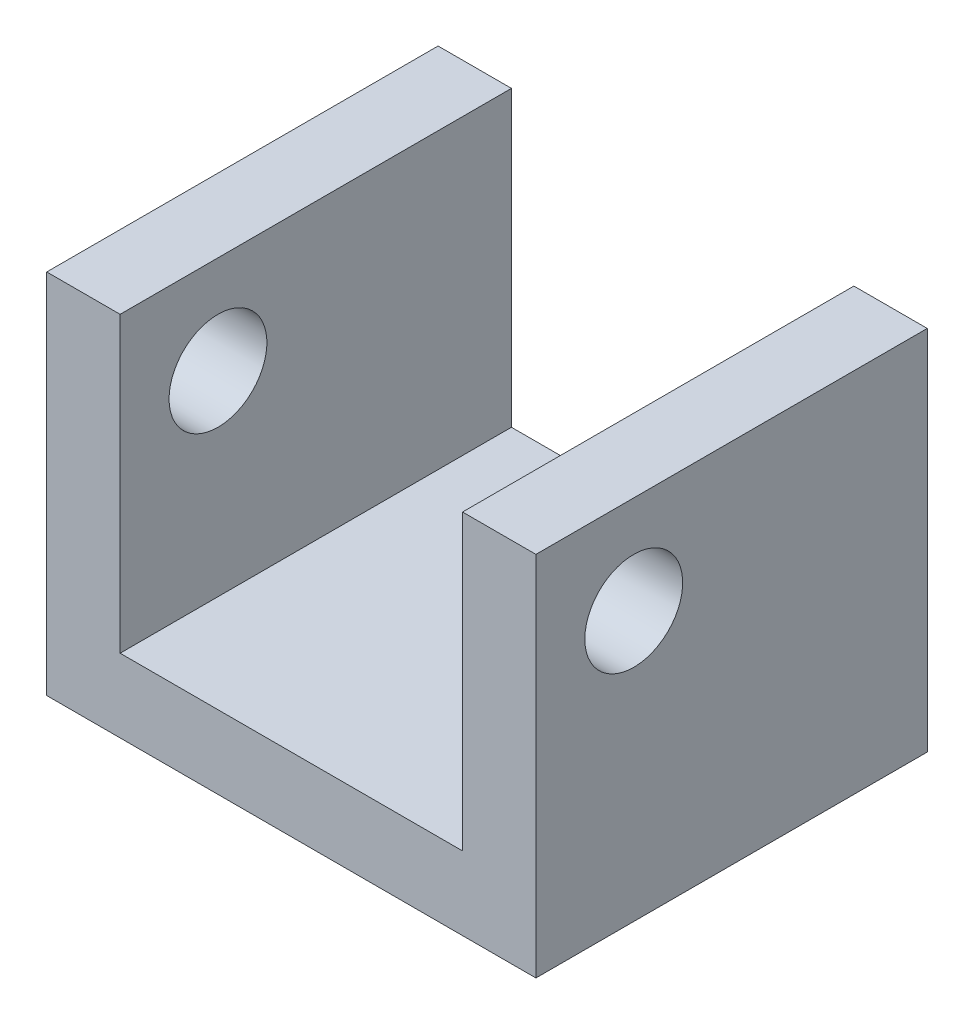
ISO-10303-21;
HEADER;
FILE_DESCRIPTION(('STEP AP214'),'2;1');
FILE_NAME('part.step','',(''),(''),'','','');
FILE_SCHEMA(('AUTOMOTIVE_DESIGN { 1 0 10303 214 1 1 1 1 }'));
ENDSEC;
DATA;
#1=APPLICATION_CONTEXT('core data for automotive mechanical design processes');
#2=APPLICATION_PROTOCOL_DEFINITION('international standard','automotive_design',2000,#1);
#3=PRODUCT_CONTEXT('',#1,'mechanical');
#4=PRODUCT('Part','Part','',(#3));
#5=PRODUCT_RELATED_PRODUCT_CATEGORY('part','',(#4));
#6=PRODUCT_DEFINITION_FORMATION('','',#4);
#7=PRODUCT_DEFINITION_CONTEXT('part definition',#1,'design');
#8=PRODUCT_DEFINITION('design','',#6,#7);
#9=PRODUCT_DEFINITION_SHAPE('','',#8);
#10=(LENGTH_UNIT() NAMED_UNIT(*) SI_UNIT(.MILLI.,.METRE.));
#11=(NAMED_UNIT(*) PLANE_ANGLE_UNIT() SI_UNIT($,.RADIAN.));
#12=(NAMED_UNIT(*) SI_UNIT($,.STERADIAN.) SOLID_ANGLE_UNIT());
#13=UNCERTAINTY_MEASURE_WITH_UNIT(LENGTH_MEASURE(1.E-05),#10,'distance_accuracy_value','');
#14=(GEOMETRIC_REPRESENTATION_CONTEXT(3) GLOBAL_UNCERTAINTY_ASSIGNED_CONTEXT((#13)) GLOBAL_UNIT_ASSIGNED_CONTEXT((#10,
#11,#12)) REPRESENTATION_CONTEXT('',''));
#15=CARTESIAN_POINT('',(0.,0.,0.));
#16=DIRECTION('',(0.,0.,1.));
#17=DIRECTION('',(1.,0.,0.));
#18=AXIS2_PLACEMENT_3D('',#15,#16,#17);
#19=CARTESIAN_POINT('',(0.,1.5,0.));
#20=DIRECTION('',(0.,-1.,0.));
#21=DIRECTION('',(0.,0.,-1.));
#22=AXIS2_PLACEMENT_3D('',#19,#20,#21);
#23=PLANE('',#22);
#24=CARTESIAN_POINT('',(2.18575157973078E-13,1.5,-1.73471109239894));
#25=DIRECTION('',(0.,1.,0.));
#26=DIRECTION('',(0.,0.,1.));
#27=AXIS2_PLACEMENT_3D('',#24,#25,#26);
#28=CIRCLE('',#27,1.2);
#29=CARTESIAN_POINT('',(2.18575157973078E-13,1.5,-0.534711092398936));
#30=VERTEX_POINT('',#29);
#31=EDGE_CURVE('E177',#30,#30,#28,.T.);
#32=ORIENTED_EDGE('',*,*,#31,.F.);
#33=EDGE_LOOP('',(#32));
#34=FACE_BOUND('',#33,.T.);
#35=DIRECTION('',(0.,0.,1.));
#36=VECTOR('',#35,1.);
#37=CARTESIAN_POINT('',(3.49999999999999,1.5,-4.));
#38=LINE('',#37,#36);
#39=CARTESIAN_POINT('',(3.49999999999999,1.5,-4.));
#40=VERTEX_POINT('',#39);
#41=CARTESIAN_POINT('',(3.49999999999999,1.5,4.));
#42=VERTEX_POINT('',#41);
#43=EDGE_CURVE('E49',#40,#42,#38,.T.);
#44=ORIENTED_EDGE('',*,*,#43,.F.);
#45=DIRECTION('',(-1.,0.,0.));
#46=VECTOR('',#45,1.);
#47=CARTESIAN_POINT('',(-5.,1.5,-4.));
#48=LINE('',#47,#46);
#49=CARTESIAN_POINT('',(-3.5,1.5,-4.));
#50=VERTEX_POINT('',#49);
#51=EDGE_CURVE('E119',#40,#50,#48,.T.);
#52=ORIENTED_EDGE('',*,*,#51,.T.);
#53=DIRECTION('',(0.,0.,-1.));
#54=VECTOR('',#53,1.);
#55=CARTESIAN_POINT('',(-3.5,1.5,-4.));
#56=LINE('',#55,#54);
#57=CARTESIAN_POINT('',(-3.5,1.5,4.));
#58=VERTEX_POINT('',#57);
#59=EDGE_CURVE('E120',#58,#50,#56,.T.);
#60=ORIENTED_EDGE('',*,*,#59,.F.);
#61=DIRECTION('',(1.,0.,0.));
#62=VECTOR('',#61,1.);
#63=CARTESIAN_POINT('',(-5.,1.5,4.));
#64=LINE('',#63,#62);
#65=EDGE_CURVE('E54',#58,#42,#64,.T.);
#66=ORIENTED_EDGE('',*,*,#65,.T.);
#67=EDGE_LOOP('',(#44,#52,#60,#66));
#68=FACE_BOUND('',#67,.T.);
#69=ADVANCED_FACE('F33',(#34,#68),#23,.F.);
#70=CARTESIAN_POINT('',(5.,1.5,4.));
#71=DIRECTION('',(-1.,0.,0.));
#72=DIRECTION('',(0.,0.,1.));
#73=AXIS2_PLACEMENT_3D('',#70,#71,#72);
#74=PLANE('',#73);
#75=CARTESIAN_POINT('',(5.,5.5,2.));
#76=DIRECTION('',(-1.,0.,0.));
#77=DIRECTION('',(0.,0.,1.));
#78=AXIS2_PLACEMENT_3D('',#75,#76,#77);
#79=CIRCLE('',#78,1.);
#80=CARTESIAN_POINT('',(5.,5.5,3.));
#81=VERTEX_POINT('',#80);
#82=EDGE_CURVE('E190',#81,#81,#79,.T.);
#83=ORIENTED_EDGE('',*,*,#82,.T.);
#84=EDGE_LOOP('',(#83));
#85=FACE_BOUND('',#84,.T.);
#86=DIRECTION('',(0.,0.,-1.));
#87=VECTOR('',#86,1.);
#88=CARTESIAN_POINT('',(5.,0.,4.));
#89=LINE('',#88,#87);
#90=CARTESIAN_POINT('',(5.,0.,4.));
#91=VERTEX_POINT('',#90);
#92=CARTESIAN_POINT('',(5.,0.,-4.));
#93=VERTEX_POINT('',#92);
#94=EDGE_CURVE('E142',#91,#93,#89,.T.);
#95=ORIENTED_EDGE('',*,*,#94,.T.);
#96=DIRECTION('',(0.,-1.,0.));
#97=VECTOR('',#96,1.);
#98=CARTESIAN_POINT('',(5.,1.5,-4.));
#99=LINE('',#98,#97);
#100=CARTESIAN_POINT('',(4.99999999999999,7.5,-4.));
#101=VERTEX_POINT('',#100);
#102=EDGE_CURVE('E11',#101,#93,#99,.T.);
#103=ORIENTED_EDGE('',*,*,#102,.F.);
#104=DIRECTION('',(0.,0.,-1.));
#105=VECTOR('',#104,1.);
#106=CARTESIAN_POINT('',(4.99999999999999,7.5,-4.));
#107=LINE('',#106,#105);
#108=CARTESIAN_POINT('',(5.,7.5,4.));
#109=VERTEX_POINT('',#108);
#110=EDGE_CURVE('E114',#109,#101,#107,.T.);
#111=ORIENTED_EDGE('',*,*,#110,.F.);
#112=DIRECTION('',(0.,-1.,0.));
#113=VECTOR('',#112,1.);
#114=CARTESIAN_POINT('',(5.,1.5,4.));
#115=LINE('',#114,#113);
#116=EDGE_CURVE('E146',#109,#91,#115,.T.);
#117=ORIENTED_EDGE('',*,*,#116,.T.);
#118=EDGE_LOOP('',(#95,#103,#111,#117));
#119=FACE_BOUND('',#118,.T.);
#120=ADVANCED_FACE('F35',(#85,#119),#74,.F.);
#121=CARTESIAN_POINT('',(-5.,1.5,-4.));
#122=DIRECTION('',(0.,0.,1.));
#123=DIRECTION('',(1.,0.,0.));
#124=AXIS2_PLACEMENT_3D('',#121,#122,#123);
#125=PLANE('',#124);
#126=DIRECTION('',(-1.,0.,0.));
#127=VECTOR('',#126,1.);
#128=CARTESIAN_POINT('',(-5.,0.,-4.));
#129=LINE('',#128,#127);
#130=CARTESIAN_POINT('',(-5.,0.,-4.));
#131=VERTEX_POINT('',#130);
#132=EDGE_CURVE('E149',#93,#131,#129,.T.);
#133=ORIENTED_EDGE('',*,*,#132,.T.);
#134=DIRECTION('',(0.,-1.,0.));
#135=VECTOR('',#134,1.);
#136=CARTESIAN_POINT('',(-5.,1.5,-4.));
#137=LINE('',#136,#135);
#138=CARTESIAN_POINT('',(-5.,7.5,-4.));
#139=VERTEX_POINT('',#138);
#140=EDGE_CURVE('E42',#139,#131,#137,.T.);
#141=ORIENTED_EDGE('',*,*,#140,.F.);
#142=DIRECTION('',(-1.,0.,0.));
#143=VECTOR('',#142,1.);
#144=CARTESIAN_POINT('',(-5.,7.5,-4.));
#145=LINE('',#144,#143);
#146=CARTESIAN_POINT('',(-3.5,7.5,-4.));
#147=VERTEX_POINT('',#146);
#148=EDGE_CURVE('E134',#147,#139,#145,.T.);
#149=ORIENTED_EDGE('',*,*,#148,.F.);
#150=DIRECTION('',(0.,-1.,0.));
#151=VECTOR('',#150,1.);
#152=CARTESIAN_POINT('',(-3.5,7.5,-4.));
#153=LINE('',#152,#151);
#154=EDGE_CURVE('E136',#147,#50,#153,.T.);
#155=ORIENTED_EDGE('',*,*,#154,.T.);
#156=ORIENTED_EDGE('',*,*,#51,.F.);
#157=DIRECTION('',(0.,-1.,0.));
#158=VECTOR('',#157,1.);
#159=CARTESIAN_POINT('',(3.49999999999999,7.5,-4.));
#160=LINE('',#159,#158);
#161=CARTESIAN_POINT('',(3.49999999999999,7.5,-4.));
#162=VERTEX_POINT('',#161);
#163=EDGE_CURVE('E101',#162,#40,#160,.T.);
#164=ORIENTED_EDGE('',*,*,#163,.F.);
#165=DIRECTION('',(-1.,0.,0.));
#166=VECTOR('',#165,1.);
#167=CARTESIAN_POINT('',(4.99999999999999,7.5,-4.));
#168=LINE('',#167,#166);
#169=EDGE_CURVE('E108',#101,#162,#168,.T.);
#170=ORIENTED_EDGE('',*,*,#169,.F.);
#171=ORIENTED_EDGE('',*,*,#102,.T.);
#172=EDGE_LOOP('',(#133,#141,#149,#155,#156,#164,#170,#171));
#173=FACE_BOUND('',#172,.T.);
#174=ADVANCED_FACE('F117',(#173),#125,.F.);
#175=CARTESIAN_POINT('',(-5.,1.5,4.));
#176=DIRECTION('',(1.,0.,0.));
#177=DIRECTION('',(0.,0.,-1.));
#178=AXIS2_PLACEMENT_3D('',#175,#176,#177);
#179=PLANE('',#178);
#180=CARTESIAN_POINT('',(-5.,5.5,2.));
#181=DIRECTION('',(-1.,0.,0.));
#182=DIRECTION('',(0.,0.,1.));
#183=AXIS2_PLACEMENT_3D('',#180,#181,#182);
#184=CIRCLE('',#183,1.);
#185=CARTESIAN_POINT('',(-5.,5.5,3.));
#186=VERTEX_POINT('',#185);
#187=EDGE_CURVE('E187',#186,#186,#184,.T.);
#188=ORIENTED_EDGE('',*,*,#187,.F.);
#189=EDGE_LOOP('',(#188));
#190=FACE_BOUND('',#189,.T.);
#191=DIRECTION('',(0.,0.,1.));
#192=VECTOR('',#191,1.);
#193=CARTESIAN_POINT('',(-5.,0.,4.));
#194=LINE('',#193,#192);
#195=CARTESIAN_POINT('',(-5.,0.,4.));
#196=VERTEX_POINT('',#195);
#197=EDGE_CURVE('E151',#131,#196,#194,.T.);
#198=ORIENTED_EDGE('',*,*,#197,.T.);
#199=DIRECTION('',(0.,-1.,0.));
#200=VECTOR('',#199,1.);
#201=CARTESIAN_POINT('',(-5.,1.5,4.));
#202=LINE('',#201,#200);
#203=CARTESIAN_POINT('',(-5.,7.5,4.));
#204=VERTEX_POINT('',#203);
#205=EDGE_CURVE('E156',#204,#196,#202,.T.);
#206=ORIENTED_EDGE('',*,*,#205,.F.);
#207=DIRECTION('',(0.,0.,1.));
#208=VECTOR('',#207,1.);
#209=CARTESIAN_POINT('',(-5.,7.5,-4.));
#210=LINE('',#209,#208);
#211=EDGE_CURVE('E123',#139,#204,#210,.T.);
#212=ORIENTED_EDGE('',*,*,#211,.F.);
#213=ORIENTED_EDGE('',*,*,#140,.T.);
#214=EDGE_LOOP('',(#198,#206,#212,#213));
#215=FACE_BOUND('',#214,.T.);
#216=ADVANCED_FACE('F163',(#190,#215),#179,.F.);
#217=CARTESIAN_POINT('',(-5.,1.5,4.));
#218=DIRECTION('',(0.,0.,-1.));
#219=DIRECTION('',(-1.,0.,0.));
#220=AXIS2_PLACEMENT_3D('',#217,#218,#219);
#221=PLANE('',#220);
#222=DIRECTION('',(1.,0.,0.));
#223=VECTOR('',#222,1.);
#224=CARTESIAN_POINT('',(-5.,0.,4.));
#225=LINE('',#224,#223);
#226=EDGE_CURVE('E144',#196,#91,#225,.T.);
#227=ORIENTED_EDGE('',*,*,#226,.T.);
#228=ORIENTED_EDGE('',*,*,#116,.F.);
#229=DIRECTION('',(1.,0.,0.));
#230=VECTOR('',#229,1.);
#231=CARTESIAN_POINT('',(5.,7.5,4.));
#232=LINE('',#231,#230);
#233=CARTESIAN_POINT('',(3.5,7.5,4.));
#234=VERTEX_POINT('',#233);
#235=EDGE_CURVE('E107',#234,#109,#232,.T.);
#236=ORIENTED_EDGE('',*,*,#235,.F.);
#237=DIRECTION('',(0.,-1.,0.));
#238=VECTOR('',#237,1.);
#239=CARTESIAN_POINT('',(3.5,7.5,4.));
#240=LINE('',#239,#238);
#241=EDGE_CURVE('E103',#234,#42,#240,.T.);
#242=ORIENTED_EDGE('',*,*,#241,.T.);
#243=ORIENTED_EDGE('',*,*,#65,.F.);
#244=DIRECTION('',(0.,-1.,0.));
#245=VECTOR('',#244,1.);
#246=CARTESIAN_POINT('',(-3.5,7.5,4.));
#247=LINE('',#246,#245);
#248=CARTESIAN_POINT('',(-3.5,7.5,4.));
#249=VERTEX_POINT('',#248);
#250=EDGE_CURVE('E139',#249,#58,#247,.T.);
#251=ORIENTED_EDGE('',*,*,#250,.F.);
#252=DIRECTION('',(1.,0.,0.));
#253=VECTOR('',#252,1.);
#254=CARTESIAN_POINT('',(-5.,7.5,4.));
#255=LINE('',#254,#253);
#256=EDGE_CURVE('E130',#204,#249,#255,.T.);
#257=ORIENTED_EDGE('',*,*,#256,.F.);
#258=ORIENTED_EDGE('',*,*,#205,.T.);
#259=EDGE_LOOP('',(#227,#228,#236,#242,#243,#251,#257,#258));
#260=FACE_BOUND('',#259,.T.);
#261=ADVANCED_FACE('F170',(#260),#221,.F.);
#262=CARTESIAN_POINT('',(0.,0.,0.));
#263=DIRECTION('',(0.,-1.,0.));
#264=DIRECTION('',(0.,0.,-1.));
#265=AXIS2_PLACEMENT_3D('',#262,#263,#264);
#266=PLANE('',#265);
#267=CARTESIAN_POINT('',(2.18575157973078E-13,0.,-1.73471109239894));
#268=DIRECTION('',(0.,1.,0.));
#269=DIRECTION('',(0.,0.,1.));
#270=AXIS2_PLACEMENT_3D('',#267,#268,#269);
#271=CIRCLE('',#270,1.2);
#272=CARTESIAN_POINT('',(2.18575157973078E-13,0.,-0.534711092398936));
#273=VERTEX_POINT('',#272);
#274=EDGE_CURVE('E175',#273,#273,#271,.T.);
#275=ORIENTED_EDGE('',*,*,#274,.T.);
#276=EDGE_LOOP('',(#275));
#277=FACE_BOUND('',#276,.T.);
#278=ORIENTED_EDGE('',*,*,#94,.F.);
#279=ORIENTED_EDGE('',*,*,#226,.F.);
#280=ORIENTED_EDGE('',*,*,#197,.F.);
#281=ORIENTED_EDGE('',*,*,#132,.F.);
#282=EDGE_LOOP('',(#278,#279,#280,#281));
#283=FACE_BOUND('',#282,.T.);
#284=ADVANCED_FACE('F168',(#277,#283),#266,.T.);
#285=CARTESIAN_POINT('',(-3.5,7.5,-4.));
#286=DIRECTION('',(-1.,0.,0.));
#287=DIRECTION('',(0.,0.,1.));
#288=AXIS2_PLACEMENT_3D('',#285,#286,#287);
#289=PLANE('',#288);
#290=CARTESIAN_POINT('',(-3.5,5.5,2.));
#291=DIRECTION('',(-1.,0.,0.));
#292=DIRECTION('',(0.,0.,1.));
#293=AXIS2_PLACEMENT_3D('',#290,#291,#292);
#294=CIRCLE('',#293,1.);
#295=CARTESIAN_POINT('',(-3.5,5.5,3.));
#296=VERTEX_POINT('',#295);
#297=EDGE_CURVE('E182',#296,#296,#294,.T.);
#298=ORIENTED_EDGE('',*,*,#297,.T.);
#299=EDGE_LOOP('',(#298));
#300=FACE_BOUND('',#299,.T.);
#301=ORIENTED_EDGE('',*,*,#59,.T.);
#302=ORIENTED_EDGE('',*,*,#154,.F.);
#303=DIRECTION('',(0.,0.,-1.));
#304=VECTOR('',#303,1.);
#305=CARTESIAN_POINT('',(-3.5,7.5,-4.));
#306=LINE('',#305,#304);
#307=EDGE_CURVE('E132',#249,#147,#306,.T.);
#308=ORIENTED_EDGE('',*,*,#307,.F.);
#309=ORIENTED_EDGE('',*,*,#250,.T.);
#310=EDGE_LOOP('',(#301,#302,#308,#309));
#311=FACE_BOUND('',#310,.T.);
#312=ADVANCED_FACE('F222',(#300,#311),#289,.F.);
#313=CARTESIAN_POINT('',(0.,7.5,0.));
#314=DIRECTION('',(0.,1.,0.));
#315=DIRECTION('',(0.,0.,1.));
#316=AXIS2_PLACEMENT_3D('',#313,#314,#315);
#317=PLANE('',#316);
#318=ORIENTED_EDGE('',*,*,#211,.T.);
#319=ORIENTED_EDGE('',*,*,#256,.T.);
#320=ORIENTED_EDGE('',*,*,#307,.T.);
#321=ORIENTED_EDGE('',*,*,#148,.T.);
#322=EDGE_LOOP('',(#318,#319,#320,#321));
#323=FACE_BOUND('',#322,.T.);
#324=ADVANCED_FACE('F264',(#323),#317,.T.);
#325=CARTESIAN_POINT('',(3.49999999999999,7.5,-4.));
#326=DIRECTION('',(1.,0.,0.));
#327=DIRECTION('',(0.,0.,-1.));
#328=AXIS2_PLACEMENT_3D('',#325,#326,#327);
#329=PLANE('',#328);
#330=CARTESIAN_POINT('',(3.5,5.5,2.));
#331=DIRECTION('',(1.,0.,0.));
#332=DIRECTION('',(0.,0.,-1.));
#333=AXIS2_PLACEMENT_3D('',#330,#331,#332);
#334=CIRCLE('',#333,1.);
#335=CARTESIAN_POINT('',(3.5,5.5,1.));
#336=VERTEX_POINT('',#335);
#337=EDGE_CURVE('E37',#336,#336,#334,.T.);
#338=ORIENTED_EDGE('',*,*,#337,.T.);
#339=EDGE_LOOP('',(#338));
#340=FACE_BOUND('',#339,.T.);
#341=ORIENTED_EDGE('',*,*,#43,.T.);
#342=ORIENTED_EDGE('',*,*,#241,.F.);
#343=DIRECTION('',(0.,0.,1.));
#344=VECTOR('',#343,1.);
#345=CARTESIAN_POINT('',(3.49999999999999,7.5,-4.));
#346=LINE('',#345,#344);
#347=EDGE_CURVE('E97',#162,#234,#346,.T.);
#348=ORIENTED_EDGE('',*,*,#347,.F.);
#349=ORIENTED_EDGE('',*,*,#163,.T.);
#350=EDGE_LOOP('',(#341,#342,#348,#349));
#351=FACE_BOUND('',#350,.T.);
#352=ADVANCED_FACE('F99',(#340,#351),#329,.F.);
#353=CARTESIAN_POINT('',(0.,7.5,0.));
#354=DIRECTION('',(0.,1.,0.));
#355=DIRECTION('',(0.,0.,1.));
#356=AXIS2_PLACEMENT_3D('',#353,#354,#355);
#357=PLANE('',#356);
#358=ORIENTED_EDGE('',*,*,#169,.T.);
#359=ORIENTED_EDGE('',*,*,#347,.T.);
#360=ORIENTED_EDGE('',*,*,#235,.T.);
#361=ORIENTED_EDGE('',*,*,#110,.T.);
#362=EDGE_LOOP('',(#358,#359,#360,#361));
#363=FACE_BOUND('',#362,.T.);
#364=ADVANCED_FACE('F112',(#363),#357,.T.);
#365=CARTESIAN_POINT('',(2.18575157973078E-13,0.,-1.73471109239894));
#366=DIRECTION('',(0.,1.,0.));
#367=DIRECTION('',(0.,0.,1.));
#368=AXIS2_PLACEMENT_3D('',#365,#366,#367);
#369=CYLINDRICAL_SURFACE('',#368,1.2);
#370=ORIENTED_EDGE('',*,*,#274,.F.);
#371=EDGE_LOOP('',(#370));
#372=FACE_BOUND('',#371,.T.);
#373=ORIENTED_EDGE('',*,*,#31,.T.);
#374=EDGE_LOOP('',(#373));
#375=FACE_BOUND('',#374,.T.);
#376=ADVANCED_FACE('F201',(#372,#375),#369,.F.);
#377=CARTESIAN_POINT('',(5.,5.5,2.));
#378=DIRECTION('',(-1.,0.,0.));
#379=DIRECTION('',(0.,0.,1.));
#380=AXIS2_PLACEMENT_3D('',#377,#378,#379);
#381=CYLINDRICAL_SURFACE('',#380,1.);
#382=ORIENTED_EDGE('',*,*,#82,.F.);
#383=EDGE_LOOP('',(#382));
#384=FACE_BOUND('',#383,.T.);
#385=ORIENTED_EDGE('',*,*,#337,.F.);
#386=EDGE_LOOP('',(#385));
#387=FACE_BOUND('',#386,.T.);
#388=ADVANCED_FACE('F198',(#384,#387),#381,.F.);
#389=ORIENTED_EDGE('',*,*,#187,.T.);
#390=EDGE_LOOP('',(#389));
#391=FACE_BOUND('',#390,.T.);
#392=ORIENTED_EDGE('',*,*,#297,.F.);
#393=EDGE_LOOP('',(#392));
#394=FACE_BOUND('',#393,.T.);
#395=ADVANCED_FACE('F200',(#391,#394),#381,.F.);
#396=CLOSED_SHELL('',(#69,#120,#174,#216,#261,#284,#312,#324,#352,#364,#376,#388,#395));
#397=MANIFOLD_SOLID_BREP('B2',#396);
#398=ADVANCED_BREP_SHAPE_REPRESENTATION('',(#18,#397),#14);
#399=SHAPE_DEFINITION_REPRESENTATION(#9,#398);
ENDSEC;
END-ISO-10303-21;
